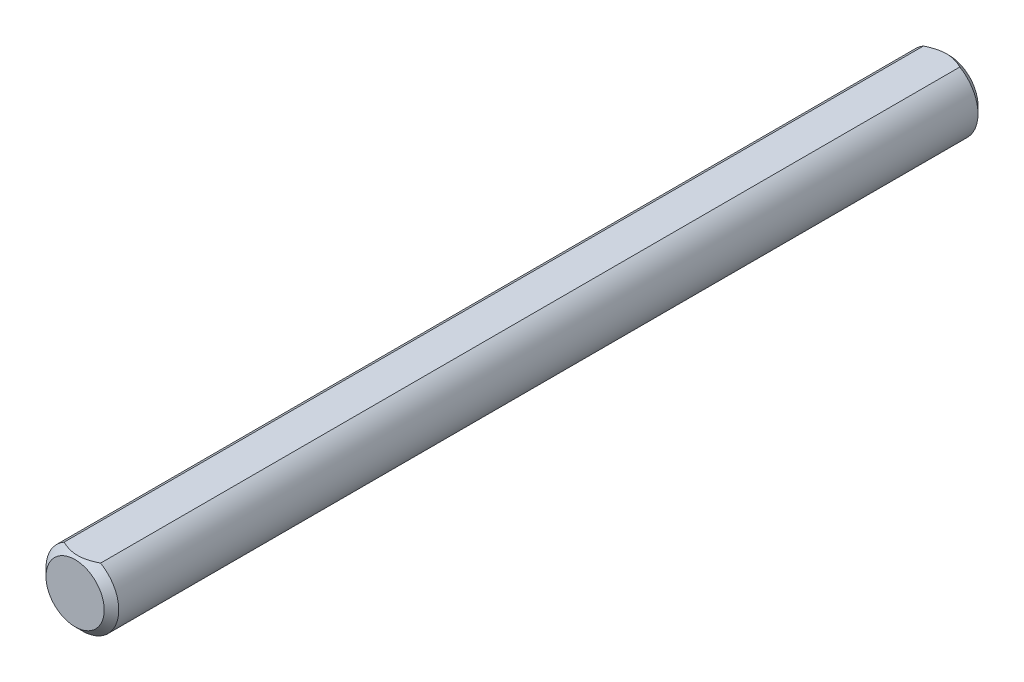
ISO-10303-21;
HEADER;
FILE_DESCRIPTION(('STEP AP214'),'2;1');
FILE_NAME('part.step','',(''),(''),'','','');
FILE_SCHEMA(('AUTOMOTIVE_DESIGN { 1 0 10303 214 1 1 1 1 }'));
ENDSEC;
DATA;
#1=APPLICATION_CONTEXT('core data for automotive mechanical design processes');
#2=APPLICATION_PROTOCOL_DEFINITION('international standard','automotive_design',2000,#1);
#3=PRODUCT_CONTEXT('',#1,'mechanical');
#4=PRODUCT('Part','Part','',(#3));
#5=PRODUCT_RELATED_PRODUCT_CATEGORY('part','',(#4));
#6=PRODUCT_DEFINITION_FORMATION('','',#4);
#7=PRODUCT_DEFINITION_CONTEXT('part definition',#1,'design');
#8=PRODUCT_DEFINITION('design','',#6,#7);
#9=PRODUCT_DEFINITION_SHAPE('','',#8);
#10=(LENGTH_UNIT() NAMED_UNIT(*) SI_UNIT(.MILLI.,.METRE.));
#11=(NAMED_UNIT(*) PLANE_ANGLE_UNIT() SI_UNIT($,.RADIAN.));
#12=(NAMED_UNIT(*) SI_UNIT($,.STERADIAN.) SOLID_ANGLE_UNIT());
#13=UNCERTAINTY_MEASURE_WITH_UNIT(LENGTH_MEASURE(1.E-05),#10,'distance_accuracy_value','');
#14=(GEOMETRIC_REPRESENTATION_CONTEXT(3) GLOBAL_UNCERTAINTY_ASSIGNED_CONTEXT((#13)) GLOBAL_UNIT_ASSIGNED_CONTEXT((#10,
#11,#12)) REPRESENTATION_CONTEXT('',''));
#15=CARTESIAN_POINT('',(0.,0.,0.));
#16=DIRECTION('',(0.,0.,1.));
#17=DIRECTION('',(1.,0.,0.));
#18=AXIS2_PLACEMENT_3D('',#15,#16,#17);
#19=CARTESIAN_POINT('',(0.,0.,38.1));
#20=DIRECTION('',(0.,0.,-1.));
#21=DIRECTION('',(-1.,0.,0.));
#22=AXIS2_PLACEMENT_3D('',#19,#20,#21);
#23=CYLINDRICAL_SURFACE('',#22,3.175);
#24=CARTESIAN_POINT('',(0.,0.,37.465));
#25=DIRECTION('',(0.,0.,1.));
#26=DIRECTION('',(1.,0.,0.));
#27=AXIS2_PLACEMENT_3D('',#24,#25,#26);
#28=CIRCLE('',#27,3.175);
#29=CARTESIAN_POINT('',(1.5875,2.74963065701559,37.465));
#30=VERTEX_POINT('',#29);
#31=CARTESIAN_POINT('',(-1.5875,2.74963065701559,37.465));
#32=VERTEX_POINT('',#31);
#33=EDGE_CURVE('E74',#30,#32,#28,.F.);
#34=ORIENTED_EDGE('',*,*,#33,.T.);
#35=DIRECTION('',(0.,0.,1.));
#36=VECTOR('',#35,1.);
#37=CARTESIAN_POINT('',(-1.5875,2.74963065701559,-38.1));
#38=LINE('',#37,#36);
#39=CARTESIAN_POINT('',(-1.5875,2.74963065701559,-37.4649999999999));
#40=VERTEX_POINT('',#39);
#41=EDGE_CURVE('E52',#40,#32,#38,.T.);
#42=ORIENTED_EDGE('',*,*,#41,.F.);
#43=CARTESIAN_POINT('',(0.,0.,-37.4649999999999));
#44=DIRECTION('',(0.,0.,1.));
#45=DIRECTION('',(1.,0.,0.));
#46=AXIS2_PLACEMENT_3D('',#43,#44,#45);
#47=CIRCLE('',#46,3.175);
#48=CARTESIAN_POINT('',(1.5875,2.74963065701559,-37.4649999999999));
#49=VERTEX_POINT('',#48);
#50=EDGE_CURVE('E73',#40,#49,#47,.T.);
#51=ORIENTED_EDGE('',*,*,#50,.T.);
#52=DIRECTION('',(0.,0.,1.));
#53=VECTOR('',#52,1.);
#54=CARTESIAN_POINT('',(1.5875,2.74963065701559,-38.1));
#55=LINE('',#54,#53);
#56=EDGE_CURVE('E62',#49,#30,#55,.T.);
#57=ORIENTED_EDGE('',*,*,#56,.T.);
#58=EDGE_LOOP('',(#34,#42,#51,#57));
#59=FACE_BOUND('',#58,.T.);
#60=ADVANCED_FACE('F33',(#59),#23,.T.);
#61=CARTESIAN_POINT('',(0.,0.,38.1));
#62=DIRECTION('',(0.,0.,1.));
#63=DIRECTION('',(1.,0.,0.));
#64=AXIS2_PLACEMENT_3D('',#61,#62,#63);
#65=PLANE('',#64);
#66=CARTESIAN_POINT('',(0.,0.,38.1));
#67=DIRECTION('',(0.,0.,1.));
#68=DIRECTION('',(1.,0.,0.));
#69=AXIS2_PLACEMENT_3D('',#66,#67,#68);
#70=CIRCLE('',#69,2.54000000000002);
#71=CARTESIAN_POINT('',(2.54000000000002,0.,38.1));
#72=VERTEX_POINT('',#71);
#73=EDGE_CURVE('E46',#72,#72,#70,.T.);
#74=ORIENTED_EDGE('',*,*,#73,.T.);
#75=EDGE_LOOP('',(#74));
#76=FACE_BOUND('',#75,.T.);
#77=ADVANCED_FACE('F84',(#76),#65,.T.);
#78=CARTESIAN_POINT('',(0.,0.,-38.1));
#79=DIRECTION('',(0.,0.,1.));
#80=DIRECTION('',(1.,0.,0.));
#81=AXIS2_PLACEMENT_3D('',#78,#79,#80);
#82=PLANE('',#81);
#83=CARTESIAN_POINT('',(0.,0.,-38.1));
#84=DIRECTION('',(0.,0.,1.));
#85=DIRECTION('',(1.,0.,0.));
#86=AXIS2_PLACEMENT_3D('',#83,#84,#85);
#87=CIRCLE('',#86,2.53999999999994);
#88=CARTESIAN_POINT('',(2.53999999999994,0.,-38.1));
#89=VERTEX_POINT('',#88);
#90=EDGE_CURVE('E76',#89,#89,#87,.F.);
#91=ORIENTED_EDGE('',*,*,#90,.T.);
#92=EDGE_LOOP('',(#91));
#93=FACE_BOUND('',#92,.T.);
#94=ADVANCED_FACE('F92',(#93),#82,.F.);
#95=CARTESIAN_POINT('',(0.,0.,-37.4649999999999));
#96=DIRECTION('',(0.,0.,1.));
#97=DIRECTION('',(1.,0.,0.));
#98=AXIS2_PLACEMENT_3D('',#95,#96,#97);
#99=CONICAL_SURFACE('',#98,3.175,0.785398163397446);
#100=CARTESIAN_POINT('',(-3.22896135223727,2.74963065701559,-36.3989317189837));
#101=CARTESIAN_POINT('',(-3.15061649550102,2.74963065701559,-36.458566524546));
#102=CARTESIAN_POINT('',(-3.07184009651261,2.74963065701559,-36.517643482025));
#103=CARTESIAN_POINT('',(-2.91325130568816,2.74963065701559,-36.6344297176183));
#104=CARTESIAN_POINT('',(-2.83343866506291,2.74963065701559,-36.6921386575258));
#105=CARTESIAN_POINT('',(-2.67202062852743,2.74963065701559,-36.806347547805));
#106=CARTESIAN_POINT('',(-2.59040613970425,2.74963065701559,-36.8628346895371));
#107=CARTESIAN_POINT('',(-2.42580311622161,2.74963065701559,-36.9737635143344));
#108=CARTESIAN_POINT('',(-2.34281467809332,2.74963065701559,-37.0282053402285));
#109=CARTESIAN_POINT('',(-2.17021447787226,2.74963065701559,-37.1377738711656));
#110=CARTESIAN_POINT('',(-2.0805039852419,2.74963065701559,-37.1927458353401));
#111=CARTESIAN_POINT('',(-1.89900904678689,2.74963065701559,-37.2991469931978));
#112=CARTESIAN_POINT('',(-1.80722487525633,2.74963065701559,-37.3505766518348));
#113=CARTESIAN_POINT('',(-1.62153760368928,2.74963065701559,-37.4488148050513));
#114=CARTESIAN_POINT('',(-1.52764140922492,2.74963065701559,-37.4956362501767));
#115=CARTESIAN_POINT('',(-1.33724706572098,2.74963065701559,-37.5836008153406));
#116=CARTESIAN_POINT('',(-1.24075014112707,2.74963065701559,-37.6247465535942));
#117=CARTESIAN_POINT('',(-1.05364742760747,2.74963065701559,-37.6965564372305));
#118=CARTESIAN_POINT('',(-0.963276425588629,2.74963065701559,-37.7278260439732));
#119=CARTESIAN_POINT('',(-0.780303735161093,2.74963065701559,-37.7831231873504));
#120=CARTESIAN_POINT('',(-0.687701898779452,2.74963065701559,-37.8071502421446));
#121=CARTESIAN_POINT('',(-0.502391431282842,2.74963065701559,-37.8462882908411));
#122=CARTESIAN_POINT('',(-0.409716445146748,2.74963065701559,-37.8615559547488));
#123=CARTESIAN_POINT('',(-0.22330633068526,2.74963065701559,-37.8828688420293));
#124=CARTESIAN_POINT('',(-0.129571403437362,2.74963065701559,-37.8889157860141));
#125=CARTESIAN_POINT('',(0.0543357559016815,2.74963065701559,-37.8913094852484));
#126=CARTESIAN_POINT('',(0.14450324255237,2.74963065701559,-37.8880280862278));
#127=CARTESIAN_POINT('',(0.324095543573412,2.74963065701559,-37.8727817719638));
#128=CARTESIAN_POINT('',(0.413520286896866,2.74963065701559,-37.8608160354813));
#129=CARTESIAN_POINT('',(0.59249606602407,2.74963065701559,-37.8286615235361));
#130=CARTESIAN_POINT('',(0.682021177379015,2.74963065701559,-37.8083305801751));
#131=CARTESIAN_POINT('',(0.859103373963818,2.74963065701559,-37.7605451979539));
#132=CARTESIAN_POINT('',(0.946660601088777,2.74963065701559,-37.7330912745012));
#133=CARTESIAN_POINT('',(1.21954622680462,2.74963065701559,-37.6371294821896));
#134=CARTESIAN_POINT('',(1.40108594012665,2.74963065701559,-37.5578094527363));
#135=CARTESIAN_POINT('',(1.66675889489859,2.74963065701559,-37.4255539852256));
#136=CARTESIAN_POINT('',(1.75437488385016,2.74963065701559,-37.3791526611237));
#137=CARTESIAN_POINT('',(1.92761951465599,2.74963065701559,-37.2827692377676));
#138=CARTESIAN_POINT('',(2.01324850705455,2.74963065701559,-37.2327877765755));
#139=CARTESIAN_POINT('',(2.17855184285736,2.74963065701559,-37.1325138433061));
#140=CARTESIAN_POINT('',(2.258310972488,2.74963065701559,-37.0823595590395));
#141=CARTESIAN_POINT('',(2.41646118639997,2.74963065701559,-36.9799282177625));
#142=CARTESIAN_POINT('',(2.49485216688178,2.74963065701559,-36.9276510006805));
#143=CARTESIAN_POINT('',(2.64980987258629,2.74963065701559,-36.8217831250554));
#144=CARTESIAN_POINT('',(2.72638621983959,2.74963065701559,-36.7682064917738));
#145=CARTESIAN_POINT('',(2.87849044969167,2.74963065701559,-36.6596270900169));
#146=CARTESIAN_POINT('',(2.95401861519261,2.74963065701559,-36.604624718309));
#147=CARTESIAN_POINT('',(3.02910770969623,2.74963065701559,-36.5490389555825));
#148=B_SPLINE_CURVE_WITH_KNOTS('',3,(#100,#101,#102,#103,#104,#105,#106,#107,#108,#109,#110,
#111,#112,#113,#114,#115,#116,#117,#118,#119,#120,#121,#122,#123,#124,#125,#126,#127,#128,#129,
#130,#131,#132,#133,#134,#135,#136,#137,#138,#139,#140,#141,#142,#143,#144,#145,#146,#147),
.UNSPECIFIED.,.F.,.F.,(4,2,2,2,2,2,2,2,2,2,2,2,2,2,2,2,2,2,2,2,2,2,2,4),(0.,0.295383449271204,
0.590839178498785,0.888580871622945,1.18630173399069,1.50187785569754,1.81741247644344,
2.13203338294819,2.44650866534172,2.73314264689631,3.01979569373829,3.3011475826162,
3.58244696402022,3.85269226293489,4.12296312107183,4.39803055604393,4.67307809311866,
5.26557071241306,5.56297998480375,5.86033638333461,6.14295523590872,6.42559543796917,
6.70595195130111,6.98623126477258),.UNSPECIFIED.);
#149=EDGE_CURVE('E57',#49,#40,#148,.F.);
#150=ORIENTED_EDGE('',*,*,#149,.F.);
#151=ORIENTED_EDGE('',*,*,#50,.F.);
#152=EDGE_LOOP('',(#150,#151));
#153=FACE_BOUND('',#152,.T.);
#154=ORIENTED_EDGE('',*,*,#90,.F.);
#155=EDGE_LOOP('',(#154));
#156=FACE_BOUND('',#155,.T.);
#157=ADVANCED_FACE('F71',(#153,#156),#99,.T.);
#158=CARTESIAN_POINT('',(0.,0.,38.1));
#159=DIRECTION('',(0.,0.,-1.));
#160=DIRECTION('',(-1.,0.,0.));
#161=AXIS2_PLACEMENT_3D('',#158,#159,#160);
#162=CONICAL_SURFACE('',#161,2.54000000000002,0.785398163397446);
#163=CARTESIAN_POINT('',(-3.2289613522373,2.74963065701559,36.3989317189838));
#164=CARTESIAN_POINT('',(-3.15061649550105,2.74963065701559,36.458566524546));
#165=CARTESIAN_POINT('',(-3.07184009651264,2.74963065701559,36.517643482025));
#166=CARTESIAN_POINT('',(-2.91325130568819,2.74963065701559,36.6344297176183));
#167=CARTESIAN_POINT('',(-2.83343866506295,2.74963065701559,36.6921386575258));
#168=CARTESIAN_POINT('',(-2.67202062852747,2.74963065701559,36.8063475478051));
#169=CARTESIAN_POINT('',(-2.59040613970429,2.74963065701559,36.8628346895372));
#170=CARTESIAN_POINT('',(-2.42580311622164,2.74963065701559,36.9737635143344));
#171=CARTESIAN_POINT('',(-2.34281467809335,2.74963065701559,37.0282053402285));
#172=CARTESIAN_POINT('',(-2.17021447787229,2.74963065701559,37.1377738711657));
#173=CARTESIAN_POINT('',(-2.08050398524193,2.74963065701559,37.1927458353402));
#174=CARTESIAN_POINT('',(-1.89900904678692,2.74963065701559,37.2991469931979));
#175=CARTESIAN_POINT('',(-1.80722487525635,2.74963065701559,37.3505766518349));
#176=CARTESIAN_POINT('',(-1.6215376036893,2.74963065701559,37.4488148050514));
#177=CARTESIAN_POINT('',(-1.52764140922494,2.74963065701559,37.4956362501767));
#178=CARTESIAN_POINT('',(-1.337247065721,2.74963065701559,37.5836008153407));
#179=CARTESIAN_POINT('',(-1.24075014112708,2.74963065701559,37.6247465535942));
#180=CARTESIAN_POINT('',(-1.05364742760749,2.74963065701559,37.6965564372305));
#181=CARTESIAN_POINT('',(-0.963276425588642,2.74963065701559,37.7278260439733));
#182=CARTESIAN_POINT('',(-0.780303735161106,2.74963065701559,37.7831231873505));
#183=CARTESIAN_POINT('',(-0.687701898779464,2.74963065701559,37.8071502421446));
#184=CARTESIAN_POINT('',(-0.502391431282854,2.74963065701559,37.8462882908412));
#185=CARTESIAN_POINT('',(-0.409716445146757,2.74963065701559,37.8615559547489));
#186=CARTESIAN_POINT('',(-0.223306330685268,2.74963065701559,37.8828688420294));
#187=CARTESIAN_POINT('',(-0.12957140343737,2.74963065701559,37.8889157860142));
#188=CARTESIAN_POINT('',(0.0543357559016745,2.74963065701559,37.8913094852485));
#189=CARTESIAN_POINT('',(0.144503242552363,2.74963065701559,37.8880280862278));
#190=CARTESIAN_POINT('',(0.324095543573407,2.74963065701559,37.8727817719638));
#191=CARTESIAN_POINT('',(0.413520286896861,2.74963065701559,37.8608160354814));
#192=CARTESIAN_POINT('',(0.592496066024066,2.74963065701559,37.8286615235361));
#193=CARTESIAN_POINT('',(0.682021177379011,2.74963065701559,37.8083305801752));
#194=CARTESIAN_POINT('',(0.859103373963816,2.74963065701559,37.760545197954));
#195=CARTESIAN_POINT('',(0.946660601088775,2.74963065701559,37.7330912745013));
#196=CARTESIAN_POINT('',(1.21954622680462,2.74963065701559,37.6371294821897));
#197=CARTESIAN_POINT('',(1.40108594012665,2.74963065701559,37.5578094527363));
#198=CARTESIAN_POINT('',(1.66675889489858,2.74963065701559,37.4255539852257));
#199=CARTESIAN_POINT('',(1.75437488385015,2.74963065701559,37.3791526611238));
#200=CARTESIAN_POINT('',(1.92761951465599,2.74963065701559,37.2827692377677));
#201=CARTESIAN_POINT('',(2.01324850705455,2.74963065701559,37.2327877765756));
#202=CARTESIAN_POINT('',(2.17855184285735,2.74963065701559,37.1325138433061));
#203=CARTESIAN_POINT('',(2.258310972488,2.74963065701559,37.0823595590396));
#204=CARTESIAN_POINT('',(2.41646118639996,2.74963065701559,36.9799282177626));
#205=CARTESIAN_POINT('',(2.49485216688177,2.74963065701559,36.9276510006805));
#206=CARTESIAN_POINT('',(2.64980987258628,2.74963065701559,36.8217831250554));
#207=CARTESIAN_POINT('',(2.72638621983958,2.74963065701559,36.7682064917739));
#208=CARTESIAN_POINT('',(2.87849044969166,2.74963065701559,36.6596270900169));
#209=CARTESIAN_POINT('',(2.95401861519261,2.74963065701559,36.6046247183091));
#210=CARTESIAN_POINT('',(3.02910770969622,2.74963065701559,36.5490389555826));
#211=B_SPLINE_CURVE_WITH_KNOTS('',3,(#163,#164,#165,#166,#167,#168,#169,#170,#171,#172,#173,
#174,#175,#176,#177,#178,#179,#180,#181,#182,#183,#184,#185,#186,#187,#188,#189,#190,#191,#192,
#193,#194,#195,#196,#197,#198,#199,#200,#201,#202,#203,#204,#205,#206,#207,#208,#209,#210),
.UNSPECIFIED.,.F.,.F.,(4,2,2,2,2,2,2,2,2,2,2,2,2,2,2,2,2,2,2,2,2,2,2,4),(0.,0.295383449271202,
0.590839178498783,0.888580871622943,1.18630173399069,1.50187785569755,1.81741247644346,
2.13203338294821,2.44650866534175,2.73314264689634,3.01979569373832,3.30114758261624,
3.58244696402025,3.85269226293493,4.12296312107187,4.39803055604397,4.6730780931187,
5.2655707124131,5.56297998480378,5.86033638333464,6.14295523590876,6.42559543796921,
6.70595195130115,6.98623126477261),.UNSPECIFIED.);
#212=EDGE_CURVE('E11',#32,#30,#211,.T.);
#213=ORIENTED_EDGE('',*,*,#212,.F.);
#214=ORIENTED_EDGE('',*,*,#33,.F.);
#215=EDGE_LOOP('',(#213,#214));
#216=FACE_BOUND('',#215,.T.);
#217=ORIENTED_EDGE('',*,*,#73,.F.);
#218=EDGE_LOOP('',(#217));
#219=FACE_BOUND('',#218,.T.);
#220=ADVANCED_FACE('F35',(#216,#219),#162,.T.);
#221=CARTESIAN_POINT('',(-1.5875,2.74963065701559,-38.1));
#222=DIRECTION('',(0.,-1.,0.));
#223=DIRECTION('',(0.,0.,-1.));
#224=AXIS2_PLACEMENT_3D('',#221,#222,#223);
#225=PLANE('',#224);
#226=ORIENTED_EDGE('',*,*,#149,.T.);
#227=ORIENTED_EDGE('',*,*,#41,.T.);
#228=ORIENTED_EDGE('',*,*,#212,.T.);
#229=ORIENTED_EDGE('',*,*,#56,.F.);
#230=EDGE_LOOP('',(#226,#227,#228,#229));
#231=FACE_BOUND('',#230,.T.);
#232=ADVANCED_FACE('F63',(#231),#225,.F.);
#233=CLOSED_SHELL('',(#60,#77,#94,#157,#220,#232));
#234=MANIFOLD_SOLID_BREP('B2',#233);
#235=ADVANCED_BREP_SHAPE_REPRESENTATION('',(#18,#234),#14);
#236=SHAPE_DEFINITION_REPRESENTATION(#9,#235);
ENDSEC;
END-ISO-10303-21;
